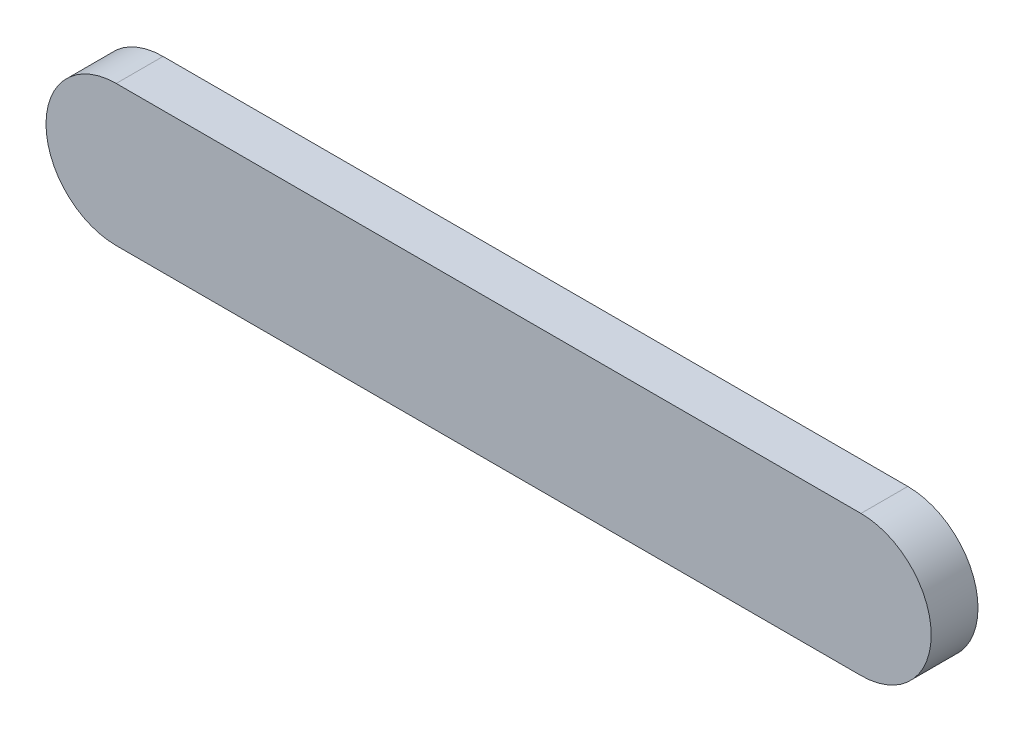
ISO-10303-21;
HEADER;
FILE_DESCRIPTION(('STEP AP214'),'2;1');
FILE_NAME('part.step','',(''),(''),'','','');
FILE_SCHEMA(('AUTOMOTIVE_DESIGN { 1 0 10303 214 1 1 1 1 }'));
ENDSEC;
DATA;
#1=APPLICATION_CONTEXT('core data for automotive mechanical design processes');
#2=APPLICATION_PROTOCOL_DEFINITION('international standard','automotive_design',2000,#1);
#3=PRODUCT_CONTEXT('',#1,'mechanical');
#4=PRODUCT('Part','Part','',(#3));
#5=PRODUCT_RELATED_PRODUCT_CATEGORY('part','',(#4));
#6=PRODUCT_DEFINITION_FORMATION('','',#4);
#7=PRODUCT_DEFINITION_CONTEXT('part definition',#1,'design');
#8=PRODUCT_DEFINITION('design','',#6,#7);
#9=PRODUCT_DEFINITION_SHAPE('','',#8);
#10=(LENGTH_UNIT() NAMED_UNIT(*) SI_UNIT(.MILLI.,.METRE.));
#11=(NAMED_UNIT(*) PLANE_ANGLE_UNIT() SI_UNIT($,.RADIAN.));
#12=(NAMED_UNIT(*) SI_UNIT($,.STERADIAN.) SOLID_ANGLE_UNIT());
#13=UNCERTAINTY_MEASURE_WITH_UNIT(LENGTH_MEASURE(1.E-05),#10,'distance_accuracy_value','');
#14=(GEOMETRIC_REPRESENTATION_CONTEXT(3) GLOBAL_UNCERTAINTY_ASSIGNED_CONTEXT((#13)) GLOBAL_UNIT_ASSIGNED_CONTEXT((#10,
#11,#12)) REPRESENTATION_CONTEXT('',''));
#15=CARTESIAN_POINT('',(0.,0.,0.));
#16=DIRECTION('',(0.,0.,1.));
#17=DIRECTION('',(1.,0.,0.));
#18=AXIS2_PLACEMENT_3D('',#15,#16,#17);
#19=CARTESIAN_POINT('',(-159.099025766973,0.,-10.));
#20=DIRECTION('',(0.,0.,1.));
#21=DIRECTION('',(1.,0.,0.));
#22=AXIS2_PLACEMENT_3D('',#19,#20,#21);
#23=CYLINDRICAL_SURFACE('',#22,30.);
#24=DIRECTION('',(0.,0.,1.));
#25=VECTOR('',#24,1.);
#26=CARTESIAN_POINT('',(-159.099025766973,-30.,-10.));
#27=LINE('',#26,#25);
#28=CARTESIAN_POINT('',(-159.099025766973,-30.,-10.));
#29=VERTEX_POINT('',#28);
#30=CARTESIAN_POINT('',(-159.099025766973,-30.,10.));
#31=VERTEX_POINT('',#30);
#32=EDGE_CURVE('E35',#29,#31,#27,.T.);
#33=ORIENTED_EDGE('',*,*,#32,.T.);
#34=CARTESIAN_POINT('',(-159.099025766973,0.,10.));
#35=DIRECTION('',(0.,0.,1.));
#36=DIRECTION('',(1.,0.,0.));
#37=AXIS2_PLACEMENT_3D('',#34,#35,#36);
#38=CIRCLE('',#37,30.);
#39=CARTESIAN_POINT('',(-159.099025766973,30.,10.));
#40=VERTEX_POINT('',#39);
#41=EDGE_CURVE('E72',#40,#31,#38,.T.);
#42=ORIENTED_EDGE('',*,*,#41,.F.);
#43=DIRECTION('',(0.,0.,1.));
#44=VECTOR('',#43,1.);
#45=CARTESIAN_POINT('',(-159.099025766973,30.,-10.));
#46=LINE('',#45,#44);
#47=CARTESIAN_POINT('',(-159.099025766973,30.,-10.));
#48=VERTEX_POINT('',#47);
#49=EDGE_CURVE('E11',#48,#40,#46,.T.);
#50=ORIENTED_EDGE('',*,*,#49,.F.);
#51=CARTESIAN_POINT('',(-159.099025766973,0.,-10.));
#52=DIRECTION('',(0.,0.,1.));
#53=DIRECTION('',(1.,0.,0.));
#54=AXIS2_PLACEMENT_3D('',#51,#52,#53);
#55=CIRCLE('',#54,30.);
#56=EDGE_CURVE('E73',#48,#29,#55,.T.);
#57=ORIENTED_EDGE('',*,*,#56,.T.);
#58=EDGE_LOOP('',(#33,#42,#50,#57));
#59=FACE_BOUND('',#58,.T.);
#60=ADVANCED_FACE('F32',(#59),#23,.T.);
#61=CARTESIAN_POINT('',(159.099025766973,30.,-10.));
#62=DIRECTION('',(0.,1.,0.));
#63=DIRECTION('',(0.,0.,1.));
#64=AXIS2_PLACEMENT_3D('',#61,#62,#63);
#65=PLANE('',#64);
#66=ORIENTED_EDGE('',*,*,#49,.T.);
#67=DIRECTION('',(-1.,0.,0.));
#68=VECTOR('',#67,1.);
#69=CARTESIAN_POINT('',(159.099025766973,30.,10.));
#70=LINE('',#69,#68);
#71=CARTESIAN_POINT('',(159.099025766973,30.,10.));
#72=VERTEX_POINT('',#71);
#73=EDGE_CURVE('E89',#72,#40,#70,.T.);
#74=ORIENTED_EDGE('',*,*,#73,.F.);
#75=DIRECTION('',(0.,0.,1.));
#76=VECTOR('',#75,1.);
#77=CARTESIAN_POINT('',(159.099025766973,30.,-10.));
#78=LINE('',#77,#76);
#79=CARTESIAN_POINT('',(159.099025766973,30.,-10.));
#80=VERTEX_POINT('',#79);
#81=EDGE_CURVE('E40',#80,#72,#78,.T.);
#82=ORIENTED_EDGE('',*,*,#81,.F.);
#83=DIRECTION('',(-1.,0.,0.));
#84=VECTOR('',#83,1.);
#85=CARTESIAN_POINT('',(159.099025766973,30.,-10.));
#86=LINE('',#85,#84);
#87=EDGE_CURVE('E78',#80,#48,#86,.T.);
#88=ORIENTED_EDGE('',*,*,#87,.T.);
#89=EDGE_LOOP('',(#66,#74,#82,#88));
#90=FACE_BOUND('',#89,.T.);
#91=ADVANCED_FACE('F104',(#90),#65,.T.);
#92=CARTESIAN_POINT('',(159.099025766973,0.,-10.));
#93=DIRECTION('',(0.,0.,1.));
#94=DIRECTION('',(1.,0.,0.));
#95=AXIS2_PLACEMENT_3D('',#92,#93,#94);
#96=CYLINDRICAL_SURFACE('',#95,30.);
#97=ORIENTED_EDGE('',*,*,#81,.T.);
#98=CARTESIAN_POINT('',(159.099025766973,0.,10.));
#99=DIRECTION('',(0.,0.,1.));
#100=DIRECTION('',(-1.,0.,0.));
#101=AXIS2_PLACEMENT_3D('',#98,#99,#100);
#102=CIRCLE('',#101,30.);
#103=CARTESIAN_POINT('',(159.099025766973,-30.,10.));
#104=VERTEX_POINT('',#103);
#105=EDGE_CURVE('E85',#104,#72,#102,.T.);
#106=ORIENTED_EDGE('',*,*,#105,.F.);
#107=DIRECTION('',(0.,0.,1.));
#108=VECTOR('',#107,1.);
#109=CARTESIAN_POINT('',(159.099025766973,-30.,-10.));
#110=LINE('',#109,#108);
#111=CARTESIAN_POINT('',(159.099025766973,-30.,-10.));
#112=VERTEX_POINT('',#111);
#113=EDGE_CURVE('E77',#112,#104,#110,.T.);
#114=ORIENTED_EDGE('',*,*,#113,.F.);
#115=CARTESIAN_POINT('',(159.099025766973,0.,-10.));
#116=DIRECTION('',(0.,0.,1.));
#117=DIRECTION('',(-1.,0.,0.));
#118=AXIS2_PLACEMENT_3D('',#115,#116,#117);
#119=CIRCLE('',#118,30.);
#120=EDGE_CURVE('E97',#112,#80,#119,.T.);
#121=ORIENTED_EDGE('',*,*,#120,.T.);
#122=EDGE_LOOP('',(#97,#106,#114,#121));
#123=FACE_BOUND('',#122,.T.);
#124=ADVANCED_FACE('F101',(#123),#96,.T.);
#125=CARTESIAN_POINT('',(-159.099025766973,-30.,-10.));
#126=DIRECTION('',(0.,-1.,0.));
#127=DIRECTION('',(0.,0.,-1.));
#128=AXIS2_PLACEMENT_3D('',#125,#126,#127);
#129=PLANE('',#128);
#130=ORIENTED_EDGE('',*,*,#113,.T.);
#131=DIRECTION('',(1.,0.,0.));
#132=VECTOR('',#131,1.);
#133=CARTESIAN_POINT('',(-159.099025766973,-30.,10.));
#134=LINE('',#133,#132);
#135=EDGE_CURVE('E80',#31,#104,#134,.T.);
#136=ORIENTED_EDGE('',*,*,#135,.F.);
#137=ORIENTED_EDGE('',*,*,#32,.F.);
#138=DIRECTION('',(1.,0.,0.));
#139=VECTOR('',#138,1.);
#140=CARTESIAN_POINT('',(-159.099025766973,-30.,-10.));
#141=LINE('',#140,#139);
#142=EDGE_CURVE('E95',#29,#112,#141,.T.);
#143=ORIENTED_EDGE('',*,*,#142,.T.);
#144=EDGE_LOOP('',(#130,#136,#137,#143));
#145=FACE_BOUND('',#144,.T.);
#146=ADVANCED_FACE('F81',(#145),#129,.T.);
#147=CARTESIAN_POINT('',(-159.099025766973,0.,-10.));
#148=DIRECTION('',(0.,0.,1.));
#149=DIRECTION('',(1.,0.,0.));
#150=AXIS2_PLACEMENT_3D('',#147,#148,#149);
#151=PLANE('',#150);
#152=ORIENTED_EDGE('',*,*,#56,.F.);
#153=ORIENTED_EDGE('',*,*,#87,.F.);
#154=ORIENTED_EDGE('',*,*,#120,.F.);
#155=ORIENTED_EDGE('',*,*,#142,.F.);
#156=EDGE_LOOP('',(#152,#153,#154,#155));
#157=FACE_BOUND('',#156,.T.);
#158=ADVANCED_FACE('F106',(#157),#151,.F.);
#159=CARTESIAN_POINT('',(-159.099025766973,0.,10.));
#160=DIRECTION('',(0.,0.,1.));
#161=DIRECTION('',(1.,0.,0.));
#162=AXIS2_PLACEMENT_3D('',#159,#160,#161);
#163=PLANE('',#162);
#164=ORIENTED_EDGE('',*,*,#41,.T.);
#165=ORIENTED_EDGE('',*,*,#135,.T.);
#166=ORIENTED_EDGE('',*,*,#105,.T.);
#167=ORIENTED_EDGE('',*,*,#73,.T.);
#168=EDGE_LOOP('',(#164,#165,#166,#167));
#169=FACE_BOUND('',#168,.T.);
#170=ADVANCED_FACE('F88',(#169),#163,.T.);
#171=CLOSED_SHELL('',(#60,#91,#124,#146,#158,#170));
#172=MANIFOLD_SOLID_BREP('B2',#171);
#173=ADVANCED_BREP_SHAPE_REPRESENTATION('',(#18,#172),#14);
#174=SHAPE_DEFINITION_REPRESENTATION(#9,#173);
ENDSEC;
END-ISO-10303-21;
